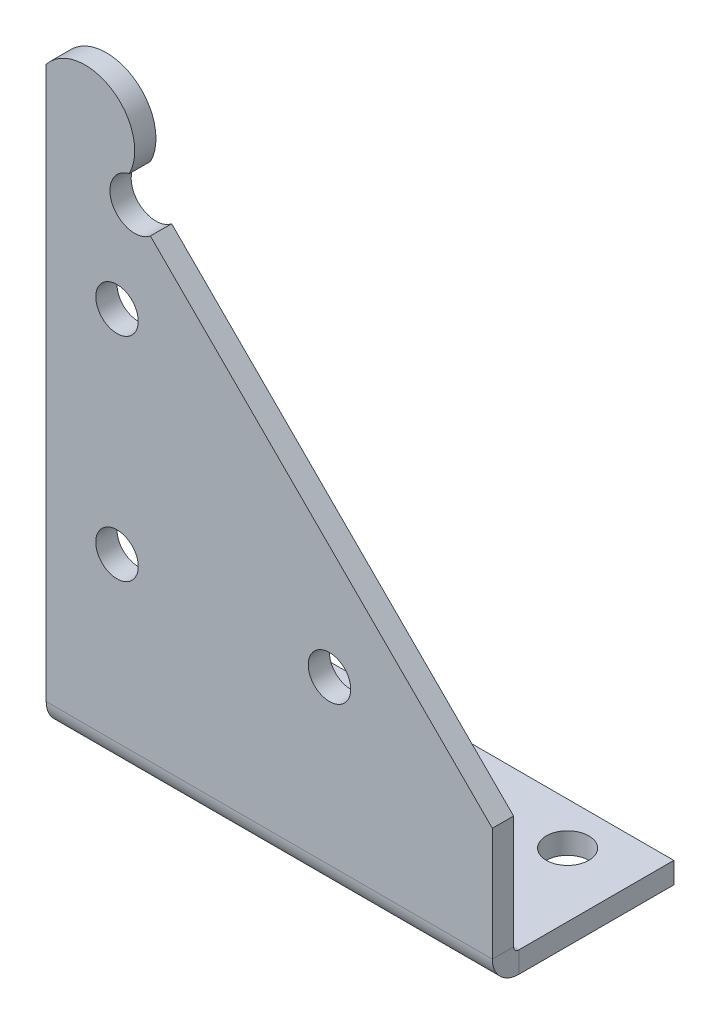
ISO-10303-21;
HEADER;
FILE_DESCRIPTION(('STEP AP214'),'2;1');
FILE_NAME('part.step','',(''),(''),'','','');
FILE_SCHEMA(('AUTOMOTIVE_DESIGN { 1 0 10303 214 1 1 1 1 }'));
ENDSEC;
DATA;
#1=APPLICATION_CONTEXT('core data for automotive mechanical design processes');
#2=APPLICATION_PROTOCOL_DEFINITION('international standard','automotive_design',2000,#1);
#3=PRODUCT_CONTEXT('',#1,'mechanical');
#4=PRODUCT('Part','Part','',(#3));
#5=PRODUCT_RELATED_PRODUCT_CATEGORY('part','',(#4));
#6=PRODUCT_DEFINITION_FORMATION('','',#4);
#7=PRODUCT_DEFINITION_CONTEXT('part definition',#1,'design');
#8=PRODUCT_DEFINITION('design','',#6,#7);
#9=PRODUCT_DEFINITION_SHAPE('','',#8);
#10=(LENGTH_UNIT() NAMED_UNIT(*) SI_UNIT(.MILLI.,.METRE.));
#11=(NAMED_UNIT(*) PLANE_ANGLE_UNIT() SI_UNIT($,.RADIAN.));
#12=(NAMED_UNIT(*) SI_UNIT($,.STERADIAN.) SOLID_ANGLE_UNIT());
#13=UNCERTAINTY_MEASURE_WITH_UNIT(LENGTH_MEASURE(1.E-05),#10,'distance_accuracy_value','');
#14=(GEOMETRIC_REPRESENTATION_CONTEXT(3) GLOBAL_UNCERTAINTY_ASSIGNED_CONTEXT((#13)) GLOBAL_UNIT_ASSIGNED_CONTEXT((#10,
#11,#12)) REPRESENTATION_CONTEXT('',''));
#15=CARTESIAN_POINT('',(0.,0.,0.));
#16=DIRECTION('',(0.,0.,1.));
#17=DIRECTION('',(1.,0.,0.));
#18=AXIS2_PLACEMENT_3D('',#15,#16,#17);
#19=CARTESIAN_POINT('',(0.,-16.7366000000001,15.7766430645095));
#20=DIRECTION('',(1.,0.,0.));
#21=DIRECTION('',(0.,0.,1.));
#22=AXIS2_PLACEMENT_3D('',#19,#20,#21);
#23=PLANE('',#22);
#24=DIRECTION('',(0.,0.,1.));
#25=VECTOR('',#24,1.);
#26=CARTESIAN_POINT('',(0.,-16.7366000000001,15.7766430645095));
#27=LINE('',#26,#25);
#28=CARTESIAN_POINT('',(0.,-16.7365999999999,-25.6233569354905));
#29=VERTEX_POINT('',#28);
#30=CARTESIAN_POINT('',(0.,-16.7366,-3.73660000000001));
#31=VERTEX_POINT('',#30);
#32=EDGE_CURVE('E241',#29,#31,#27,.T.);
#33=ORIENTED_EDGE('',*,*,#32,.T.);
#34=DIRECTION('',(0.,-1.,0.));
#35=VECTOR('',#34,1.);
#36=CARTESIAN_POINT('',(0.,-16.7366,-3.73660000000001));
#37=LINE('',#36,#35);
#38=CARTESIAN_POINT('',(0.,-19.7366,-3.73660000000002));
#39=VERTEX_POINT('',#38);
#40=EDGE_CURVE('E12',#31,#39,#37,.T.);
#41=ORIENTED_EDGE('',*,*,#40,.T.);
#42=DIRECTION('',(0.,0.,1.));
#43=VECTOR('',#42,1.);
#44=CARTESIAN_POINT('',(0.,-19.7366000000001,15.7766430645095));
#45=LINE('',#44,#43);
#46=CARTESIAN_POINT('',(0.,-19.7365999999999,-25.6233569354905));
#47=VERTEX_POINT('',#46);
#48=EDGE_CURVE('E58',#47,#39,#45,.T.);
#49=ORIENTED_EDGE('',*,*,#48,.F.);
#50=DIRECTION('',(0.,-1.,0.));
#51=VECTOR('',#50,1.);
#52=CARTESIAN_POINT('',(0.,-16.7365999999999,-25.6233569354905));
#53=LINE('',#52,#51);
#54=EDGE_CURVE('E145',#29,#47,#53,.T.);
#55=ORIENTED_EDGE('',*,*,#54,.F.);
#56=EDGE_LOOP('',(#33,#41,#49,#55));
#57=FACE_BOUND('',#56,.T.);
#58=ADVANCED_FACE('F42',(#57),#23,.T.);
#59=CARTESIAN_POINT('',(-63.,-16.7365999999999,-25.6233569354905));
#60=DIRECTION('',(-1.,0.,0.));
#61=DIRECTION('',(0.,-1.,0.));
#62=AXIS2_PLACEMENT_3D('',#59,#60,#61);
#63=PLANE('',#62);
#64=DIRECTION('',(0.,0.,-1.));
#65=VECTOR('',#64,1.);
#66=CARTESIAN_POINT('',(-63.,-19.7365999999999,-25.6233569354905));
#67=LINE('',#66,#65);
#68=CARTESIAN_POINT('',(-63.,-19.7366,-3.73660000000002));
#69=VERTEX_POINT('',#68);
#70=CARTESIAN_POINT('',(-63.,-19.7365999999999,-25.6233569354905));
#71=VERTEX_POINT('',#70);
#72=EDGE_CURVE('E65',#69,#71,#67,.T.);
#73=ORIENTED_EDGE('',*,*,#72,.F.);
#74=DIRECTION('',(0.,1.,0.));
#75=VECTOR('',#74,1.);
#76=CARTESIAN_POINT('',(-63.,-16.7366,-3.73660000000001));
#77=LINE('',#76,#75);
#78=CARTESIAN_POINT('',(-63.,-16.7366,-3.73660000000001));
#79=VERTEX_POINT('',#78);
#80=EDGE_CURVE('E118',#69,#79,#77,.T.);
#81=ORIENTED_EDGE('',*,*,#80,.T.);
#82=DIRECTION('',(0.,0.,-1.));
#83=VECTOR('',#82,1.);
#84=CARTESIAN_POINT('',(-63.,-16.7365999999999,-25.6233569354905));
#85=LINE('',#84,#83);
#86=CARTESIAN_POINT('',(-63.,-16.7365999999999,-25.6233569354905));
#87=VERTEX_POINT('',#86);
#88=EDGE_CURVE('E45',#79,#87,#85,.T.);
#89=ORIENTED_EDGE('',*,*,#88,.T.);
#90=DIRECTION('',(0.,-1.,0.));
#91=VECTOR('',#90,1.);
#92=CARTESIAN_POINT('',(-63.,-16.7365999999999,-25.6233569354905));
#93=LINE('',#92,#91);
#94=EDGE_CURVE('E245',#87,#71,#93,.T.);
#95=ORIENTED_EDGE('',*,*,#94,.T.);
#96=EDGE_LOOP('',(#73,#81,#89,#95));
#97=FACE_BOUND('',#96,.T.);
#98=ADVANCED_FACE('F120',(#97),#63,.T.);
#99=CARTESIAN_POINT('',(-57.5000000000002,-19.7366000000003,73.3721992691928));
#100=DIRECTION('',(0.,-1.,0.));
#101=DIRECTION('',(1.,0.,0.));
#102=AXIS2_PLACEMENT_3D('',#99,#100,#101);
#103=PLANE('',#102);
#104=CARTESIAN_POINT('',(-31.,-19.7366,-16.6233569354905));
#105=DIRECTION('',(0.,-1.,0.));
#106=DIRECTION('',(1.,0.,0.));
#107=AXIS2_PLACEMENT_3D('',#104,#105,#106);
#108=CIRCLE('',#107,3.);
#109=CARTESIAN_POINT('',(-28.,-19.7366,-16.6233569354905));
#110=VERTEX_POINT('',#109);
#111=EDGE_CURVE('E232',#110,#110,#108,.T.);
#112=ORIENTED_EDGE('',*,*,#111,.F.);
#113=EDGE_LOOP('',(#112));
#114=FACE_BOUND('',#113,.T.);
#115=CARTESIAN_POINT('',(-9.00000000000001,-19.7366,-19.6233569354906));
#116=DIRECTION('',(0.,-1.,0.));
#117=DIRECTION('',(1.,0.,0.));
#118=AXIS2_PLACEMENT_3D('',#115,#116,#117);
#119=CIRCLE('',#118,3.);
#120=CARTESIAN_POINT('',(-6.,-19.7366,-19.6233569354906));
#121=VERTEX_POINT('',#120);
#122=EDGE_CURVE('E226',#121,#121,#119,.T.);
#123=ORIENTED_EDGE('',*,*,#122,.F.);
#124=EDGE_LOOP('',(#123));
#125=FACE_BOUND('',#124,.T.);
#126=CARTESIAN_POINT('',(-53.,-19.7366,-19.6233569354905));
#127=DIRECTION('',(0.,-1.,0.));
#128=DIRECTION('',(1.,0.,0.));
#129=AXIS2_PLACEMENT_3D('',#126,#127,#128);
#130=CIRCLE('',#129,3.);
#131=CARTESIAN_POINT('',(-50.,-19.7366,-19.6233569354905));
#132=VERTEX_POINT('',#131);
#133=EDGE_CURVE('E166',#132,#132,#130,.T.);
#134=ORIENTED_EDGE('',*,*,#133,.F.);
#135=EDGE_LOOP('',(#134));
#136=FACE_BOUND('',#135,.T.);
#137=ORIENTED_EDGE('',*,*,#48,.T.);
#138=DIRECTION('',(-1.,0.,0.));
#139=VECTOR('',#138,1.);
#140=CARTESIAN_POINT('',(-57.5000000000002,-19.7366,-3.73660000000002));
#141=LINE('',#140,#139);
#142=EDGE_CURVE('E50',#39,#69,#141,.T.);
#143=ORIENTED_EDGE('',*,*,#142,.T.);
#144=ORIENTED_EDGE('',*,*,#72,.T.);
#145=DIRECTION('',(1.,0.,0.));
#146=VECTOR('',#145,1.);
#147=CARTESIAN_POINT('',(0.,-19.7365999999999,-25.6233569354905));
#148=LINE('',#147,#146);
#149=EDGE_CURVE('E242',#71,#47,#148,.T.);
#150=ORIENTED_EDGE('',*,*,#149,.T.);
#151=EDGE_LOOP('',(#137,#143,#144,#150));
#152=FACE_BOUND('',#151,.T.);
#153=ADVANCED_FACE('F249',(#114,#125,#136,#152),#103,.T.);
#154=CARTESIAN_POINT('',(0.,-16.7365999999999,-25.6233569354905));
#155=DIRECTION('',(0.,0.,-1.));
#156=DIRECTION('',(1.,0.,0.));
#157=AXIS2_PLACEMENT_3D('',#154,#155,#156);
#158=PLANE('',#157);
#159=ORIENTED_EDGE('',*,*,#149,.F.);
#160=ORIENTED_EDGE('',*,*,#94,.F.);
#161=DIRECTION('',(1.,0.,0.));
#162=VECTOR('',#161,1.);
#163=CARTESIAN_POINT('',(0.,-16.7365999999999,-25.6233569354905));
#164=LINE('',#163,#162);
#165=EDGE_CURVE('E136',#87,#29,#164,.T.);
#166=ORIENTED_EDGE('',*,*,#165,.T.);
#167=ORIENTED_EDGE('',*,*,#54,.T.);
#168=EDGE_LOOP('',(#159,#160,#166,#167));
#169=FACE_BOUND('',#168,.T.);
#170=ADVANCED_FACE('F253',(#169),#158,.T.);
#171=CARTESIAN_POINT('',(-57.5000000000002,-16.7366000000003,73.3721992691929));
#172=DIRECTION('',(0.,-1.,0.));
#173=DIRECTION('',(1.,0.,0.));
#174=AXIS2_PLACEMENT_3D('',#171,#172,#173);
#175=PLANE('',#174);
#176=DIRECTION('',(-1.,0.,0.));
#177=VECTOR('',#176,1.);
#178=CARTESIAN_POINT('',(-57.5000000000002,-16.7366,-3.73660000000001));
#179=LINE('',#178,#177);
#180=EDGE_CURVE('E126',#31,#79,#179,.T.);
#181=ORIENTED_EDGE('',*,*,#180,.F.);
#182=ORIENTED_EDGE('',*,*,#32,.F.);
#183=ORIENTED_EDGE('',*,*,#165,.F.);
#184=ORIENTED_EDGE('',*,*,#88,.F.);
#185=EDGE_LOOP('',(#181,#182,#183,#184));
#186=FACE_BOUND('',#185,.T.);
#187=CARTESIAN_POINT('',(-53.,-16.7366,-19.6233569354905));
#188=DIRECTION('',(0.,-1.,0.));
#189=DIRECTION('',(1.,0.,0.));
#190=AXIS2_PLACEMENT_3D('',#187,#188,#189);
#191=CIRCLE('',#190,3.);
#192=CARTESIAN_POINT('',(-50.,-16.7366,-19.6233569354905));
#193=VERTEX_POINT('',#192);
#194=EDGE_CURVE('E223',#193,#193,#191,.T.);
#195=ORIENTED_EDGE('',*,*,#194,.T.);
#196=EDGE_LOOP('',(#195));
#197=FACE_BOUND('',#196,.T.);
#198=CARTESIAN_POINT('',(-9.00000000000001,-16.7365999999999,-19.6233569354905));
#199=DIRECTION('',(0.,-1.,0.));
#200=DIRECTION('',(1.,0.,0.));
#201=AXIS2_PLACEMENT_3D('',#198,#199,#200);
#202=CIRCLE('',#201,3.);
#203=CARTESIAN_POINT('',(-6.,-16.7365999999999,-19.6233569354905));
#204=VERTEX_POINT('',#203);
#205=EDGE_CURVE('E229',#204,#204,#202,.T.);
#206=ORIENTED_EDGE('',*,*,#205,.T.);
#207=EDGE_LOOP('',(#206));
#208=FACE_BOUND('',#207,.T.);
#209=CARTESIAN_POINT('',(-31.,-16.7366,-16.6233569354905));
#210=DIRECTION('',(0.,-1.,0.));
#211=DIRECTION('',(1.,0.,0.));
#212=AXIS2_PLACEMENT_3D('',#209,#210,#211);
#213=CIRCLE('',#212,3.);
#214=CARTESIAN_POINT('',(-28.,-16.7366,-16.6233569354905));
#215=VERTEX_POINT('',#214);
#216=EDGE_CURVE('E235',#215,#215,#213,.T.);
#217=ORIENTED_EDGE('',*,*,#216,.T.);
#218=EDGE_LOOP('',(#217));
#219=FACE_BOUND('',#218,.T.);
#220=ADVANCED_FACE('F131',(#186,#197,#208,#219),#175,.F.);
#221=CARTESIAN_POINT('',(-31.,-16.7366,-16.6233569354905));
#222=DIRECTION('',(0.,-1.,0.));
#223=DIRECTION('',(1.,0.,0.));
#224=AXIS2_PLACEMENT_3D('',#221,#222,#223);
#225=CYLINDRICAL_SURFACE('',#224,3.);
#226=ORIENTED_EDGE('',*,*,#216,.F.);
#227=EDGE_LOOP('',(#226));
#228=FACE_BOUND('',#227,.T.);
#229=ORIENTED_EDGE('',*,*,#111,.T.);
#230=EDGE_LOOP('',(#229));
#231=FACE_BOUND('',#230,.T.);
#232=ADVANCED_FACE('F310',(#228,#231),#225,.F.);
#233=CARTESIAN_POINT('',(-9.00000000000001,-16.7365999999999,-19.6233569354905));
#234=DIRECTION('',(0.,-1.,0.));
#235=DIRECTION('',(1.,0.,0.));
#236=AXIS2_PLACEMENT_3D('',#233,#234,#235);
#237=CYLINDRICAL_SURFACE('',#236,3.);
#238=ORIENTED_EDGE('',*,*,#205,.F.);
#239=EDGE_LOOP('',(#238));
#240=FACE_BOUND('',#239,.T.);
#241=ORIENTED_EDGE('',*,*,#122,.T.);
#242=EDGE_LOOP('',(#241));
#243=FACE_BOUND('',#242,.T.);
#244=ADVANCED_FACE('F315',(#240,#243),#237,.F.);
#245=CARTESIAN_POINT('',(-53.,-16.7366,-19.6233569354905));
#246=DIRECTION('',(0.,-1.,0.));
#247=DIRECTION('',(1.,0.,0.));
#248=AXIS2_PLACEMENT_3D('',#245,#246,#247);
#249=CYLINDRICAL_SURFACE('',#248,3.);
#250=ORIENTED_EDGE('',*,*,#194,.F.);
#251=EDGE_LOOP('',(#250));
#252=FACE_BOUND('',#251,.T.);
#253=ORIENTED_EDGE('',*,*,#133,.T.);
#254=EDGE_LOOP('',(#253));
#255=FACE_BOUND('',#254,.T.);
#256=ADVANCED_FACE('F319',(#252,#255),#249,.F.);
#257=CARTESIAN_POINT('',(-48.285339065127,48.2853390651268,-3.));
#258=DIRECTION('',(0.707106781186546,0.707106781186549,0.));
#259=DIRECTION('',(-0.707106781186549,0.707106781186546,0.));
#260=AXIS2_PLACEMENT_3D('',#257,#258,#259);
#261=PLANE('',#260);
#262=DIRECTION('',(-0.707106781186549,0.707106781186546,0.));
#263=VECTOR('',#262,1.);
#264=CARTESIAN_POINT('',(-48.285339065127,48.2853390651268,0.));
#265=LINE('',#264,#263);
#266=CARTESIAN_POINT('',(0.,0.,0.));
#267=VERTEX_POINT('',#266);
#268=CARTESIAN_POINT('',(-48.285339065127,48.2853390651268,0.));
#269=VERTEX_POINT('',#268);
#270=EDGE_CURVE('E177',#267,#269,#265,.T.);
#271=ORIENTED_EDGE('',*,*,#270,.F.);
#272=DIRECTION('',(0.,0.,1.));
#273=VECTOR('',#272,1.);
#274=CARTESIAN_POINT('',(0.,0.,-3.));
#275=LINE('',#274,#273);
#276=CARTESIAN_POINT('',(0.,0.,-3.));
#277=VERTEX_POINT('',#276);
#278=EDGE_CURVE('E163',#277,#267,#275,.T.);
#279=ORIENTED_EDGE('',*,*,#278,.F.);
#280=DIRECTION('',(-0.707106781186549,0.707106781186546,0.));
#281=VECTOR('',#280,1.);
#282=CARTESIAN_POINT('',(-48.285339065127,48.2853390651268,-3.));
#283=LINE('',#282,#281);
#284=CARTESIAN_POINT('',(-48.285339065127,48.2853390651268,-3.));
#285=VERTEX_POINT('',#284);
#286=EDGE_CURVE('E217',#277,#285,#283,.T.);
#287=ORIENTED_EDGE('',*,*,#286,.T.);
#288=DIRECTION('',(0.,0.,1.));
#289=VECTOR('',#288,1.);
#290=CARTESIAN_POINT('',(-48.285339065127,48.2853390651268,-3.));
#291=LINE('',#290,#289);
#292=EDGE_CURVE('E215',#285,#269,#291,.T.);
#293=ORIENTED_EDGE('',*,*,#292,.T.);
#294=EDGE_LOOP('',(#271,#279,#287,#293));
#295=FACE_BOUND('',#294,.T.);
#296=ADVANCED_FACE('F281',(#295),#261,.T.);
#297=CARTESIAN_POINT('',(-50.5000000000002,50.9955562046834,-3.));
#298=DIRECTION('',(0.,0.,1.));
#299=DIRECTION('',(1.,0.,0.));
#300=AXIS2_PLACEMENT_3D('',#297,#298,#299);
#301=CYLINDRICAL_SURFACE('',#300,3.5);
#302=CARTESIAN_POINT('',(-50.5000000000002,50.9955562046834,0.));
#303=DIRECTION('',(0.,0.,-1.));
#304=DIRECTION('',(1.,0.,0.));
#305=AXIS2_PLACEMENT_3D('',#302,#303,#304);
#306=CIRCLE('',#305,3.5);
#307=CARTESIAN_POINT('',(-51.2665463456327,54.4105828078005,0.));
#308=VERTEX_POINT('',#307);
#309=EDGE_CURVE('E174',#269,#308,#306,.T.);
#310=ORIENTED_EDGE('',*,*,#309,.F.);
#311=ORIENTED_EDGE('',*,*,#292,.F.);
#312=CARTESIAN_POINT('',(-50.5000000000002,50.9955562046834,-3.));
#313=DIRECTION('',(0.,0.,-1.));
#314=DIRECTION('',(1.,0.,0.));
#315=AXIS2_PLACEMENT_3D('',#312,#313,#314);
#316=CIRCLE('',#315,3.5);
#317=CARTESIAN_POINT('',(-51.2665463456327,54.4105828078005,-3.));
#318=VERTEX_POINT('',#317);
#319=EDGE_CURVE('E212',#285,#318,#316,.T.);
#320=ORIENTED_EDGE('',*,*,#319,.T.);
#321=DIRECTION('',(0.,0.,1.));
#322=VECTOR('',#321,1.);
#323=CARTESIAN_POINT('',(-51.2665463456327,54.4105828078005,-3.));
#324=LINE('',#323,#322);
#325=EDGE_CURVE('E210',#318,#308,#324,.T.);
#326=ORIENTED_EDGE('',*,*,#325,.T.);
#327=EDGE_LOOP('',(#310,#311,#320,#326));
#328=FACE_BOUND('',#327,.T.);
#329=ADVANCED_FACE('F284',(#328),#301,.F.);
#330=CARTESIAN_POINT('',(-57.5000000000002,57.5955562046834,-3.));
#331=DIRECTION('',(0.,0.,1.));
#332=DIRECTION('',(1.,0.,0.));
#333=AXIS2_PLACEMENT_3D('',#330,#331,#332);
#334=CYLINDRICAL_SURFACE('',#333,7.);
#335=CARTESIAN_POINT('',(-57.5000000000002,57.5955562046834,0.));
#336=DIRECTION('',(0.,0.,1.));
#337=DIRECTION('',(1.,0.,0.));
#338=AXIS2_PLACEMENT_3D('',#335,#336,#337);
#339=CIRCLE('',#338,7.);
#340=CARTESIAN_POINT('',(-63.,61.9256832236059,0.));
#341=VERTEX_POINT('',#340);
#342=EDGE_CURVE('E171',#308,#341,#339,.T.);
#343=ORIENTED_EDGE('',*,*,#342,.F.);
#344=ORIENTED_EDGE('',*,*,#325,.F.);
#345=CARTESIAN_POINT('',(-57.5000000000002,57.5955562046834,-3.));
#346=DIRECTION('',(0.,0.,1.));
#347=DIRECTION('',(1.,0.,0.));
#348=AXIS2_PLACEMENT_3D('',#345,#346,#347);
#349=CIRCLE('',#348,7.);
#350=CARTESIAN_POINT('',(-63.,61.9256832236059,-3.));
#351=VERTEX_POINT('',#350);
#352=EDGE_CURVE('E207',#318,#351,#349,.T.);
#353=ORIENTED_EDGE('',*,*,#352,.T.);
#354=DIRECTION('',(0.,0.,1.));
#355=VECTOR('',#354,1.);
#356=CARTESIAN_POINT('',(-63.,61.9256832236059,-3.));
#357=LINE('',#356,#355);
#358=EDGE_CURVE('E205',#351,#341,#357,.T.);
#359=ORIENTED_EDGE('',*,*,#358,.T.);
#360=EDGE_LOOP('',(#343,#344,#353,#359));
#361=FACE_BOUND('',#360,.T.);
#362=ADVANCED_FACE('F286',(#361),#334,.T.);
#363=CARTESIAN_POINT('',(-23.,7.00000000000001,-3.));
#364=DIRECTION('',(0.,0.,1.));
#365=DIRECTION('',(1.,0.,0.));
#366=AXIS2_PLACEMENT_3D('',#363,#364,#365);
#367=CYLINDRICAL_SURFACE('',#366,3.);
#368=CARTESIAN_POINT('',(-23.,7.00000000000001,-3.));
#369=DIRECTION('',(0.,0.,1.));
#370=DIRECTION('',(1.,0.,0.));
#371=AXIS2_PLACEMENT_3D('',#368,#369,#370);
#372=CIRCLE('',#371,3.);
#373=CARTESIAN_POINT('',(-20.,7.00000000000001,-3.));
#374=VERTEX_POINT('',#373);
#375=EDGE_CURVE('E187',#374,#374,#372,.T.);
#376=ORIENTED_EDGE('',*,*,#375,.F.);
#377=EDGE_LOOP('',(#376));
#378=FACE_BOUND('',#377,.T.);
#379=CARTESIAN_POINT('',(-23.,7.00000000000001,0.));
#380=DIRECTION('',(0.,0.,1.));
#381=DIRECTION('',(1.,0.,0.));
#382=AXIS2_PLACEMENT_3D('',#379,#380,#381);
#383=CIRCLE('',#382,3.);
#384=CARTESIAN_POINT('',(-20.,7.00000000000001,0.));
#385=VERTEX_POINT('',#384);
#386=EDGE_CURVE('E202',#385,#385,#383,.T.);
#387=ORIENTED_EDGE('',*,*,#386,.T.);
#388=EDGE_LOOP('',(#387));
#389=FACE_BOUND('',#388,.T.);
#390=ADVANCED_FACE('F288',(#378,#389),#367,.F.);
#391=CARTESIAN_POINT('',(-53.,37.,-3.));
#392=DIRECTION('',(0.,0.,1.));
#393=DIRECTION('',(1.,0.,0.));
#394=AXIS2_PLACEMENT_3D('',#391,#392,#393);
#395=CYLINDRICAL_SURFACE('',#394,3.);
#396=CARTESIAN_POINT('',(-53.,37.,-3.));
#397=DIRECTION('',(0.,0.,1.));
#398=DIRECTION('',(1.,0.,0.));
#399=AXIS2_PLACEMENT_3D('',#396,#397,#398);
#400=CIRCLE('',#399,3.);
#401=CARTESIAN_POINT('',(-50.,37.,-3.));
#402=VERTEX_POINT('',#401);
#403=EDGE_CURVE('E190',#402,#402,#400,.T.);
#404=ORIENTED_EDGE('',*,*,#403,.F.);
#405=EDGE_LOOP('',(#404));
#406=FACE_BOUND('',#405,.T.);
#407=CARTESIAN_POINT('',(-53.,37.,0.));
#408=DIRECTION('',(0.,0.,1.));
#409=DIRECTION('',(1.,0.,0.));
#410=AXIS2_PLACEMENT_3D('',#407,#408,#409);
#411=CIRCLE('',#410,3.);
#412=CARTESIAN_POINT('',(-50.,37.,0.));
#413=VERTEX_POINT('',#412);
#414=EDGE_CURVE('E199',#413,#413,#411,.T.);
#415=ORIENTED_EDGE('',*,*,#414,.T.);
#416=EDGE_LOOP('',(#415));
#417=FACE_BOUND('',#416,.T.);
#418=ADVANCED_FACE('F294',(#406,#417),#395,.F.);
#419=CARTESIAN_POINT('',(-53.,7.00000000000001,-3.));
#420=DIRECTION('',(0.,0.,1.));
#421=DIRECTION('',(1.,0.,0.));
#422=AXIS2_PLACEMENT_3D('',#419,#420,#421);
#423=CYLINDRICAL_SURFACE('',#422,3.);
#424=CARTESIAN_POINT('',(-53.,7.00000000000001,-3.));
#425=DIRECTION('',(0.,0.,1.));
#426=DIRECTION('',(1.,0.,0.));
#427=AXIS2_PLACEMENT_3D('',#424,#425,#426);
#428=CIRCLE('',#427,3.);
#429=CARTESIAN_POINT('',(-50.,7.00000000000001,-3.));
#430=VERTEX_POINT('',#429);
#431=EDGE_CURVE('E193',#430,#430,#428,.T.);
#432=ORIENTED_EDGE('',*,*,#431,.F.);
#433=EDGE_LOOP('',(#432));
#434=FACE_BOUND('',#433,.T.);
#435=CARTESIAN_POINT('',(-53.,7.00000000000001,0.));
#436=DIRECTION('',(0.,0.,1.));
#437=DIRECTION('',(1.,0.,0.));
#438=AXIS2_PLACEMENT_3D('',#435,#436,#437);
#439=CIRCLE('',#438,3.);
#440=CARTESIAN_POINT('',(-50.,7.00000000000001,0.));
#441=VERTEX_POINT('',#440);
#442=EDGE_CURVE('E196',#441,#441,#439,.T.);
#443=ORIENTED_EDGE('',*,*,#442,.T.);
#444=EDGE_LOOP('',(#443));
#445=FACE_BOUND('',#444,.T.);
#446=ADVANCED_FACE('F332',(#434,#445),#423,.F.);
#447=CARTESIAN_POINT('',(-57.5000000000002,57.5955562046834,-3.));
#448=DIRECTION('',(0.,0.,1.));
#449=DIRECTION('',(1.,0.,0.));
#450=AXIS2_PLACEMENT_3D('',#447,#448,#449);
#451=PLANE('',#450);
#452=ORIENTED_EDGE('',*,*,#431,.T.);
#453=EDGE_LOOP('',(#452));
#454=FACE_BOUND('',#453,.T.);
#455=ORIENTED_EDGE('',*,*,#403,.T.);
#456=EDGE_LOOP('',(#455));
#457=FACE_BOUND('',#456,.T.);
#458=ORIENTED_EDGE('',*,*,#375,.T.);
#459=EDGE_LOOP('',(#458));
#460=FACE_BOUND('',#459,.T.);
#461=DIRECTION('',(0.,1.,0.));
#462=VECTOR('',#461,1.);
#463=CARTESIAN_POINT('',(0.,0.,-3.));
#464=LINE('',#463,#462);
#465=CARTESIAN_POINT('',(0.,-16.,-3.));
#466=VERTEX_POINT('',#465);
#467=EDGE_CURVE('E167',#466,#277,#464,.T.);
#468=ORIENTED_EDGE('',*,*,#467,.F.);
#469=DIRECTION('',(-1.,0.,0.));
#470=VECTOR('',#469,1.);
#471=CARTESIAN_POINT('',(-57.5000000000002,-16.,-3.));
#472=LINE('',#471,#470);
#473=CARTESIAN_POINT('',(-63.,-16.,-3.));
#474=VERTEX_POINT('',#473);
#475=EDGE_CURVE('E184',#466,#474,#472,.T.);
#476=ORIENTED_EDGE('',*,*,#475,.T.);
#477=DIRECTION('',(0.,-1.,0.));
#478=VECTOR('',#477,1.);
#479=CARTESIAN_POINT('',(-63.,-41.4,-3.));
#480=LINE('',#479,#478);
#481=EDGE_CURVE('E182',#351,#474,#480,.T.);
#482=ORIENTED_EDGE('',*,*,#481,.F.);
#483=ORIENTED_EDGE('',*,*,#352,.F.);
#484=ORIENTED_EDGE('',*,*,#319,.F.);
#485=ORIENTED_EDGE('',*,*,#286,.F.);
#486=EDGE_LOOP('',(#468,#476,#482,#483,#484,#485));
#487=FACE_BOUND('',#486,.T.);
#488=ADVANCED_FACE('F277',(#454,#457,#460,#487),#451,.F.);
#489=CARTESIAN_POINT('',(-63.,-41.4,-3.));
#490=DIRECTION('',(-1.,0.,0.));
#491=DIRECTION('',(0.,0.,1.));
#492=AXIS2_PLACEMENT_3D('',#489,#490,#491);
#493=PLANE('',#492);
#494=DIRECTION('',(0.,0.,-1.));
#495=VECTOR('',#494,1.);
#496=CARTESIAN_POINT('',(-63.,-16.,-3.));
#497=LINE('',#496,#495);
#498=CARTESIAN_POINT('',(-63.,-16.,0.));
#499=VERTEX_POINT('',#498);
#500=EDGE_CURVE('E150',#499,#474,#497,.T.);
#501=ORIENTED_EDGE('',*,*,#500,.F.);
#502=DIRECTION('',(0.,-1.,0.));
#503=VECTOR('',#502,1.);
#504=CARTESIAN_POINT('',(-63.,-41.4,0.));
#505=LINE('',#504,#503);
#506=EDGE_CURVE('E169',#341,#499,#505,.T.);
#507=ORIENTED_EDGE('',*,*,#506,.F.);
#508=ORIENTED_EDGE('',*,*,#358,.F.);
#509=ORIENTED_EDGE('',*,*,#481,.T.);
#510=EDGE_LOOP('',(#501,#507,#508,#509));
#511=FACE_BOUND('',#510,.T.);
#512=ADVANCED_FACE('F273',(#511),#493,.T.);
#513=CARTESIAN_POINT('',(-57.5000000000002,57.5955562046834,0.));
#514=DIRECTION('',(0.,0.,1.));
#515=DIRECTION('',(1.,0.,0.));
#516=AXIS2_PLACEMENT_3D('',#513,#514,#515);
#517=PLANE('',#516);
#518=DIRECTION('',(-1.,0.,0.));
#519=VECTOR('',#518,1.);
#520=CARTESIAN_POINT('',(-57.5000000000002,-16.,0.));
#521=LINE('',#520,#519);
#522=CARTESIAN_POINT('',(0.,-16.,0.));
#523=VERTEX_POINT('',#522);
#524=EDGE_CURVE('E154',#523,#499,#521,.T.);
#525=ORIENTED_EDGE('',*,*,#524,.F.);
#526=DIRECTION('',(0.,1.,0.));
#527=VECTOR('',#526,1.);
#528=CARTESIAN_POINT('',(0.,0.,0.));
#529=LINE('',#528,#527);
#530=EDGE_CURVE('E180',#523,#267,#529,.T.);
#531=ORIENTED_EDGE('',*,*,#530,.T.);
#532=ORIENTED_EDGE('',*,*,#270,.T.);
#533=ORIENTED_EDGE('',*,*,#309,.T.);
#534=ORIENTED_EDGE('',*,*,#342,.T.);
#535=ORIENTED_EDGE('',*,*,#506,.T.);
#536=EDGE_LOOP('',(#525,#531,#532,#533,#534,#535));
#537=FACE_BOUND('',#536,.T.);
#538=ORIENTED_EDGE('',*,*,#386,.F.);
#539=EDGE_LOOP('',(#538));
#540=FACE_BOUND('',#539,.T.);
#541=ORIENTED_EDGE('',*,*,#414,.F.);
#542=EDGE_LOOP('',(#541));
#543=FACE_BOUND('',#542,.T.);
#544=ORIENTED_EDGE('',*,*,#442,.F.);
#545=EDGE_LOOP('',(#544));
#546=FACE_BOUND('',#545,.T.);
#547=ADVANCED_FACE('F268',(#537,#540,#543,#546),#517,.T.);
#548=CARTESIAN_POINT('',(0.,0.,-3.));
#549=DIRECTION('',(1.,0.,0.));
#550=DIRECTION('',(0.,1.,0.));
#551=AXIS2_PLACEMENT_3D('',#548,#549,#550);
#552=PLANE('',#551);
#553=DIRECTION('',(0.,0.,1.));
#554=VECTOR('',#553,1.);
#555=CARTESIAN_POINT('',(0.,-16.,-3.));
#556=LINE('',#555,#554);
#557=EDGE_CURVE('E151',#466,#523,#556,.T.);
#558=ORIENTED_EDGE('',*,*,#557,.F.);
#559=ORIENTED_EDGE('',*,*,#467,.T.);
#560=ORIENTED_EDGE('',*,*,#278,.T.);
#561=ORIENTED_EDGE('',*,*,#530,.F.);
#562=EDGE_LOOP('',(#558,#559,#560,#561));
#563=FACE_BOUND('',#562,.T.);
#564=ADVANCED_FACE('F263',(#563),#552,.T.);
#565=CARTESIAN_POINT('',(0.,-16.,-3.7366));
#566=DIRECTION('',(-1.,0.,0.));
#567=DIRECTION('',(0.,-1.,0.));
#568=AXIS2_PLACEMENT_3D('',#565,#566,#567);
#569=PLANE('',#568);
#570=ORIENTED_EDGE('',*,*,#557,.T.);
#571=CARTESIAN_POINT('',(0.,-16.,-3.7366));
#572=DIRECTION('',(-1.,0.,0.));
#573=DIRECTION('',(0.,-1.,0.));
#574=AXIS2_PLACEMENT_3D('',#571,#572,#573);
#575=CIRCLE('',#574,3.7366);
#576=EDGE_CURVE('E160',#523,#39,#575,.F.);
#577=ORIENTED_EDGE('',*,*,#576,.T.);
#578=ORIENTED_EDGE('',*,*,#40,.F.);
#579=CARTESIAN_POINT('',(0.,-16.,-3.7366));
#580=DIRECTION('',(1.,0.,0.));
#581=DIRECTION('',(0.,-1.,0.));
#582=AXIS2_PLACEMENT_3D('',#579,#580,#581);
#583=CIRCLE('',#582,0.7366);
#584=EDGE_CURVE('E144',#466,#31,#583,.T.);
#585=ORIENTED_EDGE('',*,*,#584,.F.);
#586=EDGE_LOOP('',(#570,#577,#578,#585));
#587=FACE_BOUND('',#586,.T.);
#588=ADVANCED_FACE('F260',(#587),#569,.F.);
#589=CARTESIAN_POINT('',(-63.,-16.,-3.7366));
#590=DIRECTION('',(1.,0.,0.));
#591=DIRECTION('',(0.,0.,-1.));
#592=AXIS2_PLACEMENT_3D('',#589,#590,#591);
#593=PLANE('',#592);
#594=ORIENTED_EDGE('',*,*,#80,.F.);
#595=CARTESIAN_POINT('',(-63.,-16.,-3.7366));
#596=DIRECTION('',(-1.,0.,0.));
#597=DIRECTION('',(0.,-1.,0.));
#598=AXIS2_PLACEMENT_3D('',#595,#596,#597);
#599=CIRCLE('',#598,3.7366);
#600=EDGE_CURVE('E156',#69,#499,#599,.T.);
#601=ORIENTED_EDGE('',*,*,#600,.T.);
#602=ORIENTED_EDGE('',*,*,#500,.T.);
#603=CARTESIAN_POINT('',(-63.,-16.,-3.7366));
#604=DIRECTION('',(-1.,0.,0.));
#605=DIRECTION('',(0.,0.,-1.));
#606=AXIS2_PLACEMENT_3D('',#603,#604,#605);
#607=CIRCLE('',#606,0.7366);
#608=EDGE_CURVE('E142',#79,#474,#607,.T.);
#609=ORIENTED_EDGE('',*,*,#608,.F.);
#610=EDGE_LOOP('',(#594,#601,#602,#609));
#611=FACE_BOUND('',#610,.T.);
#612=ADVANCED_FACE('F148',(#611),#593,.F.);
#613=CARTESIAN_POINT('',(31.6691608051771,-16.,-3.7366));
#614=DIRECTION('',(-1.,0.,0.));
#615=DIRECTION('',(0.,-1.,0.));
#616=AXIS2_PLACEMENT_3D('',#613,#614,#615);
#617=CYLINDRICAL_SURFACE('',#616,0.7366);
#618=ORIENTED_EDGE('',*,*,#608,.T.);
#619=ORIENTED_EDGE('',*,*,#475,.F.);
#620=ORIENTED_EDGE('',*,*,#584,.T.);
#621=ORIENTED_EDGE('',*,*,#180,.T.);
#622=EDGE_LOOP('',(#618,#619,#620,#621));
#623=FACE_BOUND('',#622,.T.);
#624=ADVANCED_FACE('F140',(#623),#617,.F.);
#625=CARTESIAN_POINT('',(31.6691608051771,-16.,-3.7366));
#626=DIRECTION('',(-1.,0.,0.));
#627=DIRECTION('',(0.,-1.,0.));
#628=AXIS2_PLACEMENT_3D('',#625,#626,#627);
#629=CYLINDRICAL_SURFACE('',#628,3.7366);
#630=ORIENTED_EDGE('',*,*,#600,.F.);
#631=ORIENTED_EDGE('',*,*,#142,.F.);
#632=ORIENTED_EDGE('',*,*,#576,.F.);
#633=ORIENTED_EDGE('',*,*,#524,.T.);
#634=EDGE_LOOP('',(#630,#631,#632,#633));
#635=FACE_BOUND('',#634,.T.);
#636=ADVANCED_FACE('F259',(#635),#629,.T.);
#637=CLOSED_SHELL('',(#58,#98,#153,#170,#220,#232,#244,#256,#296,#329,#362,#390,#418,#446,#488,
#512,#547,#564,#588,#612,#624,#636));
#638=MANIFOLD_SOLID_BREP('B2',#637);
#639=ADVANCED_BREP_SHAPE_REPRESENTATION('',(#18,#638),#14);
#640=SHAPE_DEFINITION_REPRESENTATION(#9,#639);
ENDSEC;
END-ISO-10303-21;
